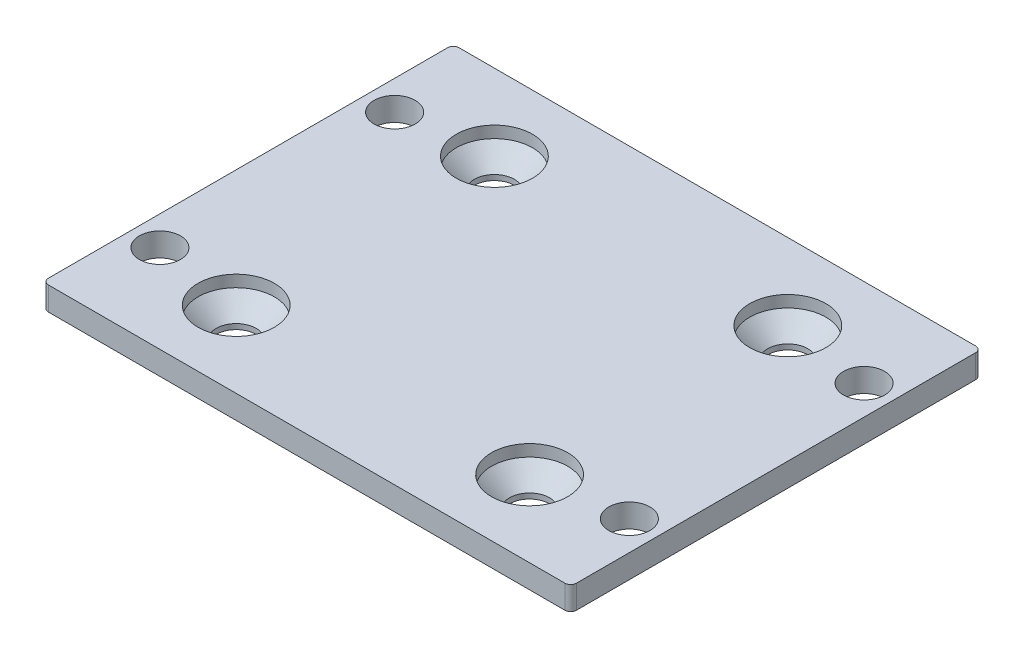
ISO-10303-21;
HEADER;
FILE_DESCRIPTION(('STEP AP214'),'2;1');
FILE_NAME('part.step','',(''),(''),'','','');
FILE_SCHEMA(('AUTOMOTIVE_DESIGN { 1 0 10303 214 1 1 1 1 }'));
ENDSEC;
DATA;
#1=APPLICATION_CONTEXT('core data for automotive mechanical design processes');
#2=APPLICATION_PROTOCOL_DEFINITION('international standard','automotive_design',2000,#1);
#3=PRODUCT_CONTEXT('',#1,'mechanical');
#4=PRODUCT('Part','Part','',(#3));
#5=PRODUCT_RELATED_PRODUCT_CATEGORY('part','',(#4));
#6=PRODUCT_DEFINITION_FORMATION('','',#4);
#7=PRODUCT_DEFINITION_CONTEXT('part definition',#1,'design');
#8=PRODUCT_DEFINITION('design','',#6,#7);
#9=PRODUCT_DEFINITION_SHAPE('','',#8);
#10=(LENGTH_UNIT() NAMED_UNIT(*) SI_UNIT(.MILLI.,.METRE.));
#11=(NAMED_UNIT(*) PLANE_ANGLE_UNIT() SI_UNIT($,.RADIAN.));
#12=(NAMED_UNIT(*) SI_UNIT($,.STERADIAN.) SOLID_ANGLE_UNIT());
#13=UNCERTAINTY_MEASURE_WITH_UNIT(LENGTH_MEASURE(1.E-05),#10,'distance_accuracy_value','');
#14=(GEOMETRIC_REPRESENTATION_CONTEXT(3) GLOBAL_UNCERTAINTY_ASSIGNED_CONTEXT((#13)) GLOBAL_UNIT_ASSIGNED_CONTEXT((#10,
#11,#12)) REPRESENTATION_CONTEXT('',''));
#15=CARTESIAN_POINT('',(0.,0.,0.));
#16=DIRECTION('',(0.,0.,1.));
#17=DIRECTION('',(1.,0.,0.));
#18=AXIS2_PLACEMENT_3D('',#15,#16,#17);
#19=CARTESIAN_POINT('',(0.,0.,0.));
#20=DIRECTION('',(0.,1.,0.));
#21=DIRECTION('',(0.,0.,1.));
#22=AXIS2_PLACEMENT_3D('',#19,#20,#21);
#23=PLANE('',#22);
#24=CARTESIAN_POINT('',(-20.,0.,-10.));
#25=DIRECTION('',(0.,-1.,0.));
#26=DIRECTION('',(0.,0.,-1.));
#27=AXIS2_PLACEMENT_3D('',#24,#25,#26);
#28=CIRCLE('',#27,1.75);
#29=CARTESIAN_POINT('',(-20.,0.,-11.75));
#30=VERTEX_POINT('',#29);
#31=EDGE_CURVE('E845',#30,#30,#28,.T.);
#32=ORIENTED_EDGE('',*,*,#31,.F.);
#33=EDGE_LOOP('',(#32));
#34=FACE_BOUND('',#33,.T.);
#35=CARTESIAN_POINT('',(20.,0.,-10.));
#36=DIRECTION('',(0.,-1.,0.));
#37=DIRECTION('',(0.,0.,-1.));
#38=AXIS2_PLACEMENT_3D('',#35,#36,#37);
#39=CIRCLE('',#38,1.75);
#40=CARTESIAN_POINT('',(20.,0.,-11.75));
#41=VERTEX_POINT('',#40);
#42=EDGE_CURVE('E841',#41,#41,#39,.T.);
#43=ORIENTED_EDGE('',*,*,#42,.F.);
#44=EDGE_LOOP('',(#43));
#45=FACE_BOUND('',#44,.T.);
#46=CARTESIAN_POINT('',(20.,0.,10.));
#47=DIRECTION('',(0.,-1.,0.));
#48=DIRECTION('',(0.,0.,-1.));
#49=AXIS2_PLACEMENT_3D('',#46,#47,#48);
#50=CIRCLE('',#49,1.75);
#51=CARTESIAN_POINT('',(20.,0.,8.25));
#52=VERTEX_POINT('',#51);
#53=EDGE_CURVE('E837',#52,#52,#50,.T.);
#54=ORIENTED_EDGE('',*,*,#53,.F.);
#55=EDGE_LOOP('',(#54));
#56=FACE_BOUND('',#55,.T.);
#57=CARTESIAN_POINT('',(-20.,0.,10.));
#58=DIRECTION('',(0.,-1.,0.));
#59=DIRECTION('',(0.,0.,-1.));
#60=AXIS2_PLACEMENT_3D('',#57,#58,#59);
#61=CIRCLE('',#60,1.75);
#62=CARTESIAN_POINT('',(-20.,0.,8.25));
#63=VERTEX_POINT('',#62);
#64=EDGE_CURVE('E833',#63,#63,#61,.T.);
#65=ORIENTED_EDGE('',*,*,#64,.F.);
#66=EDGE_LOOP('',(#65));
#67=FACE_BOUND('',#66,.T.);
#68=DIRECTION('',(-1.,0.,0.));
#69=VECTOR('',#68,1.);
#70=CARTESIAN_POINT('',(-22.5,0.,-17.5));
#71=LINE('',#70,#69);
#72=CARTESIAN_POINT('',(22.,0.,-17.5));
#73=VERTEX_POINT('',#72);
#74=CARTESIAN_POINT('',(-22.,0.,-17.5));
#75=VERTEX_POINT('',#74);
#76=EDGE_CURVE('E225',#73,#75,#71,.T.);
#77=ORIENTED_EDGE('',*,*,#76,.F.);
#78=CARTESIAN_POINT('',(22.,0.,-17.));
#79=DIRECTION('',(0.,1.,0.));
#80=DIRECTION('',(0.,0.,1.));
#81=AXIS2_PLACEMENT_3D('',#78,#79,#80);
#82=CIRCLE('',#81,0.5);
#83=CARTESIAN_POINT('',(22.5,0.,-17.));
#84=VERTEX_POINT('',#83);
#85=EDGE_CURVE('E259',#73,#84,#82,.F.);
#86=ORIENTED_EDGE('',*,*,#85,.T.);
#87=DIRECTION('',(0.,0.,-1.));
#88=VECTOR('',#87,1.);
#89=CARTESIAN_POINT('',(22.5,0.,-17.5));
#90=LINE('',#89,#88);
#91=CARTESIAN_POINT('',(22.5,0.,17.));
#92=VERTEX_POINT('',#91);
#93=EDGE_CURVE('E209',#92,#84,#90,.T.);
#94=ORIENTED_EDGE('',*,*,#93,.F.);
#95=CARTESIAN_POINT('',(22.,0.,17.));
#96=DIRECTION('',(0.,1.,0.));
#97=DIRECTION('',(0.,0.,1.));
#98=AXIS2_PLACEMENT_3D('',#95,#96,#97);
#99=CIRCLE('',#98,0.5);
#100=CARTESIAN_POINT('',(22.,0.,17.5));
#101=VERTEX_POINT('',#100);
#102=EDGE_CURVE('E255',#92,#101,#99,.F.);
#103=ORIENTED_EDGE('',*,*,#102,.T.);
#104=DIRECTION('',(1.,0.,0.));
#105=VECTOR('',#104,1.);
#106=CARTESIAN_POINT('',(-22.5,0.,17.5));
#107=LINE('',#106,#105);
#108=CARTESIAN_POINT('',(-22.,0.,17.5));
#109=VERTEX_POINT('',#108);
#110=EDGE_CURVE('E214',#109,#101,#107,.T.);
#111=ORIENTED_EDGE('',*,*,#110,.F.);
#112=CARTESIAN_POINT('',(-22.,0.,17.));
#113=DIRECTION('',(0.,1.,0.));
#114=DIRECTION('',(0.,0.,1.));
#115=AXIS2_PLACEMENT_3D('',#112,#113,#114);
#116=CIRCLE('',#115,0.5);
#117=CARTESIAN_POINT('',(-22.5,0.,17.));
#118=VERTEX_POINT('',#117);
#119=EDGE_CURVE('E253',#109,#118,#116,.F.);
#120=ORIENTED_EDGE('',*,*,#119,.T.);
#121=DIRECTION('',(0.,0.,1.));
#122=VECTOR('',#121,1.);
#123=CARTESIAN_POINT('',(-22.5,0.,-17.5));
#124=LINE('',#123,#122);
#125=CARTESIAN_POINT('',(-22.5,0.,-17.));
#126=VERTEX_POINT('',#125);
#127=EDGE_CURVE('E228',#126,#118,#124,.T.);
#128=ORIENTED_EDGE('',*,*,#127,.F.);
#129=CARTESIAN_POINT('',(-22.,0.,-17.));
#130=DIRECTION('',(0.,1.,0.));
#131=DIRECTION('',(0.,0.,1.));
#132=AXIS2_PLACEMENT_3D('',#129,#130,#131);
#133=CIRCLE('',#132,0.5);
#134=EDGE_CURVE('E257',#126,#75,#133,.F.);
#135=ORIENTED_EDGE('',*,*,#134,.T.);
#136=EDGE_LOOP('',(#77,#86,#94,#103,#111,#120,#128,#135));
#137=FACE_BOUND('',#136,.T.);
#138=DIRECTION('',(0.,0.,1.));
#139=VECTOR('',#138,1.);
#140=CARTESIAN_POINT('',(17.5,0.,16.));
#141=LINE('',#140,#139);
#142=CARTESIAN_POINT('',(17.5,0.,-11.));
#143=VERTEX_POINT('',#142);
#144=CARTESIAN_POINT('',(17.5,0.,11.));
#145=VERTEX_POINT('',#144);
#146=EDGE_CURVE('E199',#143,#145,#141,.T.);
#147=ORIENTED_EDGE('',*,*,#146,.F.);
#148=CARTESIAN_POINT('',(12.5,0.,-11.));
#149=DIRECTION('',(0.,1.,0.));
#150=DIRECTION('',(0.,0.,1.));
#151=AXIS2_PLACEMENT_3D('',#148,#149,#150);
#152=CIRCLE('',#151,5.);
#153=CARTESIAN_POINT('',(12.5,0.,-16.));
#154=VERTEX_POINT('',#153);
#155=EDGE_CURVE('E245',#143,#154,#152,.T.);
#156=ORIENTED_EDGE('',*,*,#155,.T.);
#157=DIRECTION('',(1.,0.,0.));
#158=VECTOR('',#157,1.);
#159=CARTESIAN_POINT('',(-17.5,0.,-16.));
#160=LINE('',#159,#158);
#161=CARTESIAN_POINT('',(-12.5,0.,-16.));
#162=VERTEX_POINT('',#161);
#163=EDGE_CURVE('E202',#162,#154,#160,.T.);
#164=ORIENTED_EDGE('',*,*,#163,.F.);
#165=CARTESIAN_POINT('',(-12.5,0.,-11.));
#166=DIRECTION('',(0.,1.,0.));
#167=DIRECTION('',(0.,0.,1.));
#168=AXIS2_PLACEMENT_3D('',#165,#166,#167);
#169=CIRCLE('',#168,5.);
#170=CARTESIAN_POINT('',(-17.5,0.,-11.));
#171=VERTEX_POINT('',#170);
#172=EDGE_CURVE('E192',#162,#171,#169,.T.);
#173=ORIENTED_EDGE('',*,*,#172,.T.);
#174=DIRECTION('',(0.,0.,-1.));
#175=VECTOR('',#174,1.);
#176=CARTESIAN_POINT('',(-17.5,0.,16.));
#177=LINE('',#176,#175);
#178=CARTESIAN_POINT('',(-17.5,0.,11.));
#179=VERTEX_POINT('',#178);
#180=EDGE_CURVE('E198',#179,#171,#177,.T.);
#181=ORIENTED_EDGE('',*,*,#180,.F.);
#182=CARTESIAN_POINT('',(-12.5,0.,11.));
#183=DIRECTION('',(0.,1.,0.));
#184=DIRECTION('',(0.,0.,1.));
#185=AXIS2_PLACEMENT_3D('',#182,#183,#184);
#186=CIRCLE('',#185,5.);
#187=CARTESIAN_POINT('',(-12.5,0.,16.));
#188=VERTEX_POINT('',#187);
#189=EDGE_CURVE('E197',#179,#188,#186,.T.);
#190=ORIENTED_EDGE('',*,*,#189,.T.);
#191=DIRECTION('',(-1.,0.,0.));
#192=VECTOR('',#191,1.);
#193=CARTESIAN_POINT('',(-17.5,0.,16.));
#194=LINE('',#193,#192);
#195=CARTESIAN_POINT('',(12.5,0.,16.));
#196=VERTEX_POINT('',#195);
#197=EDGE_CURVE('E175',#196,#188,#194,.T.);
#198=ORIENTED_EDGE('',*,*,#197,.F.);
#199=CARTESIAN_POINT('',(12.5,0.,11.));
#200=DIRECTION('',(0.,1.,0.));
#201=DIRECTION('',(0.,0.,1.));
#202=AXIS2_PLACEMENT_3D('',#199,#200,#201);
#203=CIRCLE('',#202,5.);
#204=EDGE_CURVE('E185',#196,#145,#203,.T.);
#205=ORIENTED_EDGE('',*,*,#204,.T.);
#206=EDGE_LOOP('',(#147,#156,#164,#173,#181,#190,#198,#205));
#207=FACE_BOUND('',#206,.T.);
#208=ADVANCED_FACE('F32',(#34,#45,#56,#67,#137,#207),#23,.F.);
#209=CARTESIAN_POINT('',(22.5,2.,-17.5));
#210=DIRECTION('',(-1.,0.,0.));
#211=DIRECTION('',(0.,0.,1.));
#212=AXIS2_PLACEMENT_3D('',#209,#210,#211);
#213=PLANE('',#212);
#214=ORIENTED_EDGE('',*,*,#93,.T.);
#215=DIRECTION('',(0.,-1.,0.));
#216=VECTOR('',#215,1.);
#217=CARTESIAN_POINT('',(22.5,2.,-17.));
#218=LINE('',#217,#216);
#219=CARTESIAN_POINT('',(22.5,2.,-17.));
#220=VERTEX_POINT('',#219);
#221=EDGE_CURVE('E264',#84,#220,#218,.F.);
#222=ORIENTED_EDGE('',*,*,#221,.T.);
#223=DIRECTION('',(0.,0.,-1.));
#224=VECTOR('',#223,1.);
#225=CARTESIAN_POINT('',(22.5,2.,-17.5));
#226=LINE('',#225,#224);
#227=CARTESIAN_POINT('',(22.5,2.,17.));
#228=VERTEX_POINT('',#227);
#229=EDGE_CURVE('E210',#228,#220,#226,.T.);
#230=ORIENTED_EDGE('',*,*,#229,.F.);
#231=DIRECTION('',(0.,-1.,0.));
#232=VECTOR('',#231,1.);
#233=CARTESIAN_POINT('',(22.5,2.,17.));
#234=LINE('',#233,#232);
#235=EDGE_CURVE('E261',#228,#92,#234,.T.);
#236=ORIENTED_EDGE('',*,*,#235,.T.);
#237=EDGE_LOOP('',(#214,#222,#230,#236));
#238=FACE_BOUND('',#237,.T.);
#239=ADVANCED_FACE('F394',(#238),#213,.F.);
#240=CARTESIAN_POINT('',(-22.5,2.,-17.5));
#241=DIRECTION('',(0.,0.,1.));
#242=DIRECTION('',(1.,0.,0.));
#243=AXIS2_PLACEMENT_3D('',#240,#241,#242);
#244=PLANE('',#243);
#245=DIRECTION('',(-1.,0.,0.));
#246=VECTOR('',#245,1.);
#247=CARTESIAN_POINT('',(-22.5,2.,-17.5));
#248=LINE('',#247,#246);
#249=CARTESIAN_POINT('',(22.,2.,-17.5));
#250=VERTEX_POINT('',#249);
#251=CARTESIAN_POINT('',(-22.,2.,-17.5));
#252=VERTEX_POINT('',#251);
#253=EDGE_CURVE('E213',#250,#252,#248,.T.);
#254=ORIENTED_EDGE('',*,*,#253,.F.);
#255=DIRECTION('',(0.,-1.,0.));
#256=VECTOR('',#255,1.);
#257=CARTESIAN_POINT('',(22.,2.,-17.5));
#258=LINE('',#257,#256);
#259=EDGE_CURVE('E250',#250,#73,#258,.T.);
#260=ORIENTED_EDGE('',*,*,#259,.T.);
#261=ORIENTED_EDGE('',*,*,#76,.T.);
#262=DIRECTION('',(0.,-1.,0.));
#263=VECTOR('',#262,1.);
#264=CARTESIAN_POINT('',(-22.,2.,-17.5));
#265=LINE('',#264,#263);
#266=EDGE_CURVE('E248',#75,#252,#265,.F.);
#267=ORIENTED_EDGE('',*,*,#266,.T.);
#268=EDGE_LOOP('',(#254,#260,#261,#267));
#269=FACE_BOUND('',#268,.T.);
#270=ADVANCED_FACE('F400',(#269),#244,.F.);
#271=CARTESIAN_POINT('',(-22.5,2.,-17.5));
#272=DIRECTION('',(1.,0.,0.));
#273=DIRECTION('',(0.,0.,-1.));
#274=AXIS2_PLACEMENT_3D('',#271,#272,#273);
#275=PLANE('',#274);
#276=DIRECTION('',(0.,0.,1.));
#277=VECTOR('',#276,1.);
#278=CARTESIAN_POINT('',(-22.5,2.,-17.5));
#279=LINE('',#278,#277);
#280=CARTESIAN_POINT('',(-22.5,2.,-17.));
#281=VERTEX_POINT('',#280);
#282=CARTESIAN_POINT('',(-22.5,2.,17.));
#283=VERTEX_POINT('',#282);
#284=EDGE_CURVE('E217',#281,#283,#279,.T.);
#285=ORIENTED_EDGE('',*,*,#284,.F.);
#286=DIRECTION('',(0.,-1.,0.));
#287=VECTOR('',#286,1.);
#288=CARTESIAN_POINT('',(-22.5,2.,-17.));
#289=LINE('',#288,#287);
#290=EDGE_CURVE('E276',#281,#126,#289,.T.);
#291=ORIENTED_EDGE('',*,*,#290,.T.);
#292=ORIENTED_EDGE('',*,*,#127,.T.);
#293=DIRECTION('',(0.,-1.,0.));
#294=VECTOR('',#293,1.);
#295=CARTESIAN_POINT('',(-22.5,2.,17.));
#296=LINE('',#295,#294);
#297=EDGE_CURVE('E274',#118,#283,#296,.F.);
#298=ORIENTED_EDGE('',*,*,#297,.T.);
#299=EDGE_LOOP('',(#285,#291,#292,#298));
#300=FACE_BOUND('',#299,.T.);
#301=ADVANCED_FACE('F412',(#300),#275,.F.);
#302=CARTESIAN_POINT('',(-22.5,2.,17.5));
#303=DIRECTION('',(0.,0.,-1.));
#304=DIRECTION('',(-1.,0.,0.));
#305=AXIS2_PLACEMENT_3D('',#302,#303,#304);
#306=PLANE('',#305);
#307=ORIENTED_EDGE('',*,*,#110,.T.);
#308=DIRECTION('',(0.,-1.,0.));
#309=VECTOR('',#308,1.);
#310=CARTESIAN_POINT('',(22.,2.,17.5));
#311=LINE('',#310,#309);
#312=CARTESIAN_POINT('',(22.,2.,17.5));
#313=VERTEX_POINT('',#312);
#314=EDGE_CURVE('E282',#101,#313,#311,.F.);
#315=ORIENTED_EDGE('',*,*,#314,.T.);
#316=DIRECTION('',(1.,0.,0.));
#317=VECTOR('',#316,1.);
#318=CARTESIAN_POINT('',(-22.5,2.,17.5));
#319=LINE('',#318,#317);
#320=CARTESIAN_POINT('',(-22.,2.,17.5));
#321=VERTEX_POINT('',#320);
#322=EDGE_CURVE('E220',#321,#313,#319,.T.);
#323=ORIENTED_EDGE('',*,*,#322,.F.);
#324=DIRECTION('',(0.,-1.,0.));
#325=VECTOR('',#324,1.);
#326=CARTESIAN_POINT('',(-22.,2.,17.5));
#327=LINE('',#326,#325);
#328=EDGE_CURVE('E279',#321,#109,#327,.T.);
#329=ORIENTED_EDGE('',*,*,#328,.T.);
#330=EDGE_LOOP('',(#307,#315,#323,#329));
#331=FACE_BOUND('',#330,.T.);
#332=ADVANCED_FACE('F409',(#331),#306,.F.);
#333=CARTESIAN_POINT('',(0.,2.,0.));
#334=DIRECTION('',(0.,1.,0.));
#335=DIRECTION('',(0.,0.,1.));
#336=AXIS2_PLACEMENT_3D('',#333,#334,#335);
#337=PLANE('',#336);
#338=CARTESIAN_POINT('',(-12.5,2.,11.));
#339=DIRECTION('',(0.,1.,0.));
#340=DIRECTION('',(0.,0.,1.));
#341=AXIS2_PLACEMENT_3D('',#338,#339,#340);
#342=CIRCLE('',#341,3.24999999999999);
#343=CARTESIAN_POINT('',(-12.5,2.,14.25));
#344=VERTEX_POINT('',#343);
#345=EDGE_CURVE('E784',#344,#344,#342,.T.);
#346=ORIENTED_EDGE('',*,*,#345,.F.);
#347=EDGE_LOOP('',(#346));
#348=FACE_BOUND('',#347,.T.);
#349=CARTESIAN_POINT('',(12.5,2.,-11.));
#350=DIRECTION('',(0.,1.,0.));
#351=DIRECTION('',(0.,0.,1.));
#352=AXIS2_PLACEMENT_3D('',#349,#350,#351);
#353=CIRCLE('',#352,3.24999999999999);
#354=CARTESIAN_POINT('',(12.5,2.,-7.75000000000001));
#355=VERTEX_POINT('',#354);
#356=EDGE_CURVE('E788',#355,#355,#353,.T.);
#357=ORIENTED_EDGE('',*,*,#356,.F.);
#358=EDGE_LOOP('',(#357));
#359=FACE_BOUND('',#358,.T.);
#360=CARTESIAN_POINT('',(-12.5,2.,-11.));
#361=DIRECTION('',(0.,1.,0.));
#362=DIRECTION('',(0.,0.,1.));
#363=AXIS2_PLACEMENT_3D('',#360,#361,#362);
#364=CIRCLE('',#363,3.24999999999999);
#365=CARTESIAN_POINT('',(-12.5,2.,-7.75000000000001));
#366=VERTEX_POINT('',#365);
#367=EDGE_CURVE('E792',#366,#366,#364,.T.);
#368=ORIENTED_EDGE('',*,*,#367,.F.);
#369=EDGE_LOOP('',(#368));
#370=FACE_BOUND('',#369,.T.);
#371=CARTESIAN_POINT('',(12.5,2.,11.));
#372=DIRECTION('',(0.,1.,0.));
#373=DIRECTION('',(0.,0.,1.));
#374=AXIS2_PLACEMENT_3D('',#371,#372,#373);
#375=CIRCLE('',#374,3.24999999999999);
#376=CARTESIAN_POINT('',(12.5,2.,14.25));
#377=VERTEX_POINT('',#376);
#378=EDGE_CURVE('E796',#377,#377,#375,.T.);
#379=ORIENTED_EDGE('',*,*,#378,.F.);
#380=EDGE_LOOP('',(#379));
#381=FACE_BOUND('',#380,.T.);
#382=CARTESIAN_POINT('',(-20.,2.,-10.));
#383=DIRECTION('',(0.,-1.,0.));
#384=DIRECTION('',(0.,0.,-1.));
#385=AXIS2_PLACEMENT_3D('',#382,#383,#384);
#386=CIRCLE('',#385,1.75);
#387=CARTESIAN_POINT('',(-20.,2.,-11.75));
#388=VERTEX_POINT('',#387);
#389=EDGE_CURVE('E800',#388,#388,#386,.T.);
#390=ORIENTED_EDGE('',*,*,#389,.T.);
#391=EDGE_LOOP('',(#390));
#392=FACE_BOUND('',#391,.T.);
#393=CARTESIAN_POINT('',(20.,2.,-10.));
#394=DIRECTION('',(0.,-1.,0.));
#395=DIRECTION('',(0.,0.,-1.));
#396=AXIS2_PLACEMENT_3D('',#393,#394,#395);
#397=CIRCLE('',#396,1.75);
#398=CARTESIAN_POINT('',(20.,2.,-11.75));
#399=VERTEX_POINT('',#398);
#400=EDGE_CURVE('E804',#399,#399,#397,.T.);
#401=ORIENTED_EDGE('',*,*,#400,.T.);
#402=EDGE_LOOP('',(#401));
#403=FACE_BOUND('',#402,.T.);
#404=CARTESIAN_POINT('',(20.,2.,10.));
#405=DIRECTION('',(0.,-1.,0.));
#406=DIRECTION('',(0.,0.,-1.));
#407=AXIS2_PLACEMENT_3D('',#404,#405,#406);
#408=CIRCLE('',#407,1.75);
#409=CARTESIAN_POINT('',(20.,2.,8.25));
#410=VERTEX_POINT('',#409);
#411=EDGE_CURVE('E808',#410,#410,#408,.T.);
#412=ORIENTED_EDGE('',*,*,#411,.T.);
#413=EDGE_LOOP('',(#412));
#414=FACE_BOUND('',#413,.T.);
#415=CARTESIAN_POINT('',(-20.,2.,10.));
#416=DIRECTION('',(0.,-1.,0.));
#417=DIRECTION('',(0.,0.,-1.));
#418=AXIS2_PLACEMENT_3D('',#415,#416,#417);
#419=CIRCLE('',#418,1.75);
#420=CARTESIAN_POINT('',(-20.,2.,8.25));
#421=VERTEX_POINT('',#420);
#422=EDGE_CURVE('E317',#421,#421,#419,.T.);
#423=ORIENTED_EDGE('',*,*,#422,.T.);
#424=EDGE_LOOP('',(#423));
#425=FACE_BOUND('',#424,.T.);
#426=ORIENTED_EDGE('',*,*,#229,.T.);
#427=CARTESIAN_POINT('',(22.,2.,-17.));
#428=DIRECTION('',(0.,1.,0.));
#429=DIRECTION('',(0.,0.,1.));
#430=AXIS2_PLACEMENT_3D('',#427,#428,#429);
#431=CIRCLE('',#430,0.5);
#432=EDGE_CURVE('E272',#220,#250,#431,.T.);
#433=ORIENTED_EDGE('',*,*,#432,.T.);
#434=ORIENTED_EDGE('',*,*,#253,.T.);
#435=CARTESIAN_POINT('',(-22.,2.,-17.));
#436=DIRECTION('',(0.,1.,0.));
#437=DIRECTION('',(0.,0.,1.));
#438=AXIS2_PLACEMENT_3D('',#435,#436,#437);
#439=CIRCLE('',#438,0.5);
#440=EDGE_CURVE('E270',#252,#281,#439,.T.);
#441=ORIENTED_EDGE('',*,*,#440,.T.);
#442=ORIENTED_EDGE('',*,*,#284,.T.);
#443=CARTESIAN_POINT('',(-22.,2.,17.));
#444=DIRECTION('',(0.,1.,0.));
#445=DIRECTION('',(0.,0.,1.));
#446=AXIS2_PLACEMENT_3D('',#443,#444,#445);
#447=CIRCLE('',#446,0.5);
#448=EDGE_CURVE('E266',#283,#321,#447,.T.);
#449=ORIENTED_EDGE('',*,*,#448,.T.);
#450=ORIENTED_EDGE('',*,*,#322,.T.);
#451=CARTESIAN_POINT('',(22.,2.,17.));
#452=DIRECTION('',(0.,1.,0.));
#453=DIRECTION('',(0.,0.,1.));
#454=AXIS2_PLACEMENT_3D('',#451,#452,#453);
#455=CIRCLE('',#454,0.5);
#456=EDGE_CURVE('E268',#313,#228,#455,.T.);
#457=ORIENTED_EDGE('',*,*,#456,.T.);
#458=EDGE_LOOP('',(#426,#433,#434,#441,#442,#449,#450,#457));
#459=FACE_BOUND('',#458,.T.);
#460=ADVANCED_FACE('F407',(#348,#359,#370,#381,#392,#403,#414,#425,#459),#337,.T.);
#461=CARTESIAN_POINT('',(17.5,-1.,16.));
#462=DIRECTION('',(-1.,0.,0.));
#463=DIRECTION('',(0.,0.,1.));
#464=AXIS2_PLACEMENT_3D('',#461,#462,#463);
#465=PLANE('',#464);
#466=DIRECTION('',(0.,1.,0.));
#467=VECTOR('',#466,1.);
#468=CARTESIAN_POINT('',(17.5,-1.,11.));
#469=LINE('',#468,#467);
#470=CARTESIAN_POINT('',(17.5,-0.5,11.));
#471=VERTEX_POINT('',#470);
#472=EDGE_CURVE('E188',#145,#471,#469,.F.);
#473=ORIENTED_EDGE('',*,*,#472,.T.);
#474=DIRECTION('',(0.,0.,-1.));
#475=VECTOR('',#474,1.);
#476=CARTESIAN_POINT('',(17.5,-0.5,-11.));
#477=LINE('',#476,#475);
#478=CARTESIAN_POINT('',(17.5,-0.5,-11.));
#479=VERTEX_POINT('',#478);
#480=EDGE_CURVE('E301',#471,#479,#477,.T.);
#481=ORIENTED_EDGE('',*,*,#480,.T.);
#482=DIRECTION('',(0.,1.,0.));
#483=VECTOR('',#482,1.);
#484=CARTESIAN_POINT('',(17.5,-1.,-11.));
#485=LINE('',#484,#483);
#486=EDGE_CURVE('E181',#479,#143,#485,.T.);
#487=ORIENTED_EDGE('',*,*,#486,.T.);
#488=ORIENTED_EDGE('',*,*,#146,.T.);
#489=EDGE_LOOP('',(#473,#481,#487,#488));
#490=FACE_BOUND('',#489,.T.);
#491=ADVANCED_FACE('F369',(#490),#465,.F.);
#492=CARTESIAN_POINT('',(-17.5,-1.,16.));
#493=DIRECTION('',(0.,0.,-1.));
#494=DIRECTION('',(-1.,0.,0.));
#495=AXIS2_PLACEMENT_3D('',#492,#493,#494);
#496=PLANE('',#495);
#497=DIRECTION('',(0.,1.,0.));
#498=VECTOR('',#497,1.);
#499=CARTESIAN_POINT('',(-12.5,-1.,16.));
#500=LINE('',#499,#498);
#501=CARTESIAN_POINT('',(-12.5,-0.5,16.));
#502=VERTEX_POINT('',#501);
#503=EDGE_CURVE('E182',#188,#502,#500,.F.);
#504=ORIENTED_EDGE('',*,*,#503,.T.);
#505=DIRECTION('',(1.,0.,0.));
#506=VECTOR('',#505,1.);
#507=CARTESIAN_POINT('',(12.5,-0.5,16.));
#508=LINE('',#507,#506);
#509=CARTESIAN_POINT('',(12.5,-0.5,16.));
#510=VERTEX_POINT('',#509);
#511=EDGE_CURVE('E178',#502,#510,#508,.T.);
#512=ORIENTED_EDGE('',*,*,#511,.T.);
#513=DIRECTION('',(0.,1.,0.));
#514=VECTOR('',#513,1.);
#515=CARTESIAN_POINT('',(12.5,-1.,16.));
#516=LINE('',#515,#514);
#517=EDGE_CURVE('E170',#510,#196,#516,.T.);
#518=ORIENTED_EDGE('',*,*,#517,.T.);
#519=ORIENTED_EDGE('',*,*,#197,.T.);
#520=EDGE_LOOP('',(#504,#512,#518,#519));
#521=FACE_BOUND('',#520,.T.);
#522=ADVANCED_FACE('F173',(#521),#496,.F.);
#523=CARTESIAN_POINT('',(-17.5,-1.,16.));
#524=DIRECTION('',(1.,0.,0.));
#525=DIRECTION('',(0.,0.,-1.));
#526=AXIS2_PLACEMENT_3D('',#523,#524,#525);
#527=PLANE('',#526);
#528=DIRECTION('',(0.,1.,0.));
#529=VECTOR('',#528,1.);
#530=CARTESIAN_POINT('',(-17.5,-1.,-11.));
#531=LINE('',#530,#529);
#532=CARTESIAN_POINT('',(-17.5,-0.5,-11.));
#533=VERTEX_POINT('',#532);
#534=EDGE_CURVE('E193',#171,#533,#531,.F.);
#535=ORIENTED_EDGE('',*,*,#534,.T.);
#536=DIRECTION('',(0.,0.,1.));
#537=VECTOR('',#536,1.);
#538=CARTESIAN_POINT('',(-17.5,-0.5,11.));
#539=LINE('',#538,#537);
#540=CARTESIAN_POINT('',(-17.5,-0.5,11.));
#541=VERTEX_POINT('',#540);
#542=EDGE_CURVE('E11',#533,#541,#539,.T.);
#543=ORIENTED_EDGE('',*,*,#542,.T.);
#544=DIRECTION('',(0.,1.,0.));
#545=VECTOR('',#544,1.);
#546=CARTESIAN_POINT('',(-17.5,-1.,11.));
#547=LINE('',#546,#545);
#548=EDGE_CURVE('E241',#541,#179,#547,.T.);
#549=ORIENTED_EDGE('',*,*,#548,.T.);
#550=ORIENTED_EDGE('',*,*,#180,.T.);
#551=EDGE_LOOP('',(#535,#543,#549,#550));
#552=FACE_BOUND('',#551,.T.);
#553=ADVANCED_FACE('F348',(#552),#527,.F.);
#554=CARTESIAN_POINT('',(-17.5,-1.,-16.));
#555=DIRECTION('',(0.,0.,1.));
#556=DIRECTION('',(1.,0.,0.));
#557=AXIS2_PLACEMENT_3D('',#554,#555,#556);
#558=PLANE('',#557);
#559=DIRECTION('',(0.,1.,0.));
#560=VECTOR('',#559,1.);
#561=CARTESIAN_POINT('',(12.5,-1.,-16.));
#562=LINE('',#561,#560);
#563=CARTESIAN_POINT('',(12.5,-0.5,-16.));
#564=VERTEX_POINT('',#563);
#565=EDGE_CURVE('E236',#154,#564,#562,.F.);
#566=ORIENTED_EDGE('',*,*,#565,.T.);
#567=DIRECTION('',(-1.,0.,0.));
#568=VECTOR('',#567,1.);
#569=CARTESIAN_POINT('',(-12.5,-0.5,-16.));
#570=LINE('',#569,#568);
#571=CARTESIAN_POINT('',(-12.5,-0.5,-16.));
#572=VERTEX_POINT('',#571);
#573=EDGE_CURVE('E309',#564,#572,#570,.T.);
#574=ORIENTED_EDGE('',*,*,#573,.T.);
#575=DIRECTION('',(0.,1.,0.));
#576=VECTOR('',#575,1.);
#577=CARTESIAN_POINT('',(-12.5,-1.,-16.));
#578=LINE('',#577,#576);
#579=EDGE_CURVE('E239',#572,#162,#578,.T.);
#580=ORIENTED_EDGE('',*,*,#579,.T.);
#581=ORIENTED_EDGE('',*,*,#163,.T.);
#582=EDGE_LOOP('',(#566,#574,#580,#581));
#583=FACE_BOUND('',#582,.T.);
#584=ADVANCED_FACE('F355',(#583),#558,.F.);
#585=CARTESIAN_POINT('',(0.,-1.,0.));
#586=DIRECTION('',(0.,-1.,0.));
#587=DIRECTION('',(0.,0.,-1.));
#588=AXIS2_PLACEMENT_3D('',#585,#586,#587);
#589=PLANE('',#588);
#590=CARTESIAN_POINT('',(-12.5,-0.999999999999999,-11.));
#591=DIRECTION('',(0.,1.,0.));
#592=DIRECTION('',(0.,0.,1.));
#593=AXIS2_PLACEMENT_3D('',#590,#591,#592);
#594=CIRCLE('',#593,1.7);
#595=CARTESIAN_POINT('',(-12.5,-0.999999999999999,-9.3));
#596=VERTEX_POINT('',#595);
#597=EDGE_CURVE('E880',#596,#596,#594,.T.);
#598=ORIENTED_EDGE('',*,*,#597,.T.);
#599=EDGE_LOOP('',(#598));
#600=FACE_BOUND('',#599,.T.);
#601=CARTESIAN_POINT('',(12.5,-0.999999999999999,11.));
#602=DIRECTION('',(0.,1.,0.));
#603=DIRECTION('',(0.,0.,1.));
#604=AXIS2_PLACEMENT_3D('',#601,#602,#603);
#605=CIRCLE('',#604,1.7);
#606=CARTESIAN_POINT('',(12.5,-0.999999999999999,12.7));
#607=VERTEX_POINT('',#606);
#608=EDGE_CURVE('E871',#607,#607,#605,.T.);
#609=ORIENTED_EDGE('',*,*,#608,.T.);
#610=EDGE_LOOP('',(#609));
#611=FACE_BOUND('',#610,.T.);
#612=CARTESIAN_POINT('',(-12.5,-0.999999999999999,11.));
#613=DIRECTION('',(0.,1.,0.));
#614=DIRECTION('',(0.,0.,1.));
#615=AXIS2_PLACEMENT_3D('',#612,#613,#614);
#616=CIRCLE('',#615,1.7);
#617=CARTESIAN_POINT('',(-12.5,-0.999999999999999,12.7));
#618=VERTEX_POINT('',#617);
#619=EDGE_CURVE('E862',#618,#618,#616,.T.);
#620=ORIENTED_EDGE('',*,*,#619,.T.);
#621=EDGE_LOOP('',(#620));
#622=FACE_BOUND('',#621,.T.);
#623=CARTESIAN_POINT('',(12.5,-0.999999999999999,-11.));
#624=DIRECTION('',(0.,1.,0.));
#625=DIRECTION('',(0.,0.,1.));
#626=AXIS2_PLACEMENT_3D('',#623,#624,#625);
#627=CIRCLE('',#626,1.7);
#628=CARTESIAN_POINT('',(12.5,-0.999999999999999,-9.3));
#629=VERTEX_POINT('',#628);
#630=EDGE_CURVE('E853',#629,#629,#627,.T.);
#631=ORIENTED_EDGE('',*,*,#630,.T.);
#632=EDGE_LOOP('',(#631));
#633=FACE_BOUND('',#632,.T.);
#634=CARTESIAN_POINT('',(12.5,-1.,-11.));
#635=DIRECTION('',(0.,-1.,0.));
#636=DIRECTION('',(0.,0.,-1.));
#637=AXIS2_PLACEMENT_3D('',#634,#635,#636);
#638=CIRCLE('',#637,4.50000000000001);
#639=CARTESIAN_POINT('',(12.5,-1.,-15.5));
#640=VERTEX_POINT('',#639);
#641=CARTESIAN_POINT('',(17.,-1.,-11.));
#642=VERTEX_POINT('',#641);
#643=EDGE_CURVE('E294',#640,#642,#638,.T.);
#644=ORIENTED_EDGE('',*,*,#643,.T.);
#645=DIRECTION('',(0.,0.,1.));
#646=VECTOR('',#645,1.);
#647=CARTESIAN_POINT('',(17.,-1.,11.));
#648=LINE('',#647,#646);
#649=CARTESIAN_POINT('',(17.,-1.,11.));
#650=VERTEX_POINT('',#649);
#651=EDGE_CURVE('E298',#642,#650,#648,.T.);
#652=ORIENTED_EDGE('',*,*,#651,.T.);
#653=CARTESIAN_POINT('',(12.5,-1.,11.));
#654=DIRECTION('',(0.,-1.,0.));
#655=DIRECTION('',(0.,0.,-1.));
#656=AXIS2_PLACEMENT_3D('',#653,#654,#655);
#657=CIRCLE('',#656,4.50000000000001);
#658=CARTESIAN_POINT('',(12.5,-1.,15.5));
#659=VERTEX_POINT('',#658);
#660=EDGE_CURVE('E296',#650,#659,#657,.T.);
#661=ORIENTED_EDGE('',*,*,#660,.T.);
#662=DIRECTION('',(-1.,0.,0.));
#663=VECTOR('',#662,1.);
#664=CARTESIAN_POINT('',(-12.5,-1.,15.5));
#665=LINE('',#664,#663);
#666=CARTESIAN_POINT('',(-12.5,-1.,15.5));
#667=VERTEX_POINT('',#666);
#668=EDGE_CURVE('E292',#659,#667,#665,.T.);
#669=ORIENTED_EDGE('',*,*,#668,.T.);
#670=CARTESIAN_POINT('',(-12.5,-1.,11.));
#671=DIRECTION('',(0.,-1.,0.));
#672=DIRECTION('',(0.,0.,-1.));
#673=AXIS2_PLACEMENT_3D('',#670,#671,#672);
#674=CIRCLE('',#673,4.50000000000001);
#675=CARTESIAN_POINT('',(-17.,-1.,11.));
#676=VERTEX_POINT('',#675);
#677=EDGE_CURVE('E288',#667,#676,#674,.T.);
#678=ORIENTED_EDGE('',*,*,#677,.T.);
#679=DIRECTION('',(0.,0.,-1.));
#680=VECTOR('',#679,1.);
#681=CARTESIAN_POINT('',(-17.,-1.,-11.));
#682=LINE('',#681,#680);
#683=CARTESIAN_POINT('',(-17.,-1.,-11.));
#684=VERTEX_POINT('',#683);
#685=EDGE_CURVE('E284',#676,#684,#682,.T.);
#686=ORIENTED_EDGE('',*,*,#685,.T.);
#687=CARTESIAN_POINT('',(-12.5,-1.,-11.));
#688=DIRECTION('',(0.,-1.,0.));
#689=DIRECTION('',(0.,0.,-1.));
#690=AXIS2_PLACEMENT_3D('',#687,#688,#689);
#691=CIRCLE('',#690,4.50000000000001);
#692=CARTESIAN_POINT('',(-12.5,-1.,-15.5));
#693=VERTEX_POINT('',#692);
#694=EDGE_CURVE('E286',#684,#693,#691,.T.);
#695=ORIENTED_EDGE('',*,*,#694,.T.);
#696=DIRECTION('',(1.,0.,0.));
#697=VECTOR('',#696,1.);
#698=CARTESIAN_POINT('',(12.5,-1.,-15.5));
#699=LINE('',#698,#697);
#700=EDGE_CURVE('E290',#693,#640,#699,.T.);
#701=ORIENTED_EDGE('',*,*,#700,.T.);
#702=EDGE_LOOP('',(#644,#652,#661,#669,#678,#686,#695,#701));
#703=FACE_BOUND('',#702,.T.);
#704=ADVANCED_FACE('F379',(#600,#611,#622,#633,#703),#589,.T.);
#705=CARTESIAN_POINT('',(12.5,-1.,11.));
#706=DIRECTION('',(0.,1.,0.));
#707=DIRECTION('',(0.,0.,1.));
#708=AXIS2_PLACEMENT_3D('',#705,#706,#707);
#709=CYLINDRICAL_SURFACE('',#708,5.);
#710=ORIENTED_EDGE('',*,*,#517,.F.);
#711=CARTESIAN_POINT('',(12.5,-0.5,11.));
#712=DIRECTION('',(0.,-1.,0.));
#713=DIRECTION('',(0.,0.,-1.));
#714=AXIS2_PLACEMENT_3D('',#711,#712,#713);
#715=CIRCLE('',#714,5.);
#716=EDGE_CURVE('E304',#510,#471,#715,.F.);
#717=ORIENTED_EDGE('',*,*,#716,.T.);
#718=ORIENTED_EDGE('',*,*,#472,.F.);
#719=ORIENTED_EDGE('',*,*,#204,.F.);
#720=EDGE_LOOP('',(#710,#717,#718,#719));
#721=FACE_BOUND('',#720,.T.);
#722=ADVANCED_FACE('F186',(#721),#709,.T.);
#723=CARTESIAN_POINT('',(-12.5,-1.,-11.));
#724=DIRECTION('',(0.,1.,0.));
#725=DIRECTION('',(0.,0.,1.));
#726=AXIS2_PLACEMENT_3D('',#723,#724,#725);
#727=CYLINDRICAL_SURFACE('',#726,5.);
#728=ORIENTED_EDGE('',*,*,#579,.F.);
#729=CARTESIAN_POINT('',(-12.5,-0.5,-11.));
#730=DIRECTION('',(0.,-1.,0.));
#731=DIRECTION('',(0.,0.,-1.));
#732=AXIS2_PLACEMENT_3D('',#729,#730,#731);
#733=CIRCLE('',#732,5.);
#734=EDGE_CURVE('E41',#572,#533,#733,.F.);
#735=ORIENTED_EDGE('',*,*,#734,.T.);
#736=ORIENTED_EDGE('',*,*,#534,.F.);
#737=ORIENTED_EDGE('',*,*,#172,.F.);
#738=EDGE_LOOP('',(#728,#735,#736,#737));
#739=FACE_BOUND('',#738,.T.);
#740=ADVANCED_FACE('F350',(#739),#727,.T.);
#741=CARTESIAN_POINT('',(12.5,-1.,-11.));
#742=DIRECTION('',(0.,1.,0.));
#743=DIRECTION('',(0.,0.,1.));
#744=AXIS2_PLACEMENT_3D('',#741,#742,#743);
#745=CYLINDRICAL_SURFACE('',#744,5.);
#746=ORIENTED_EDGE('',*,*,#486,.F.);
#747=CARTESIAN_POINT('',(12.5,-0.5,-11.));
#748=DIRECTION('',(0.,-1.,0.));
#749=DIRECTION('',(0.,0.,-1.));
#750=AXIS2_PLACEMENT_3D('',#747,#748,#749);
#751=CIRCLE('',#750,5.);
#752=EDGE_CURVE('E306',#479,#564,#751,.F.);
#753=ORIENTED_EDGE('',*,*,#752,.T.);
#754=ORIENTED_EDGE('',*,*,#565,.F.);
#755=ORIENTED_EDGE('',*,*,#155,.F.);
#756=EDGE_LOOP('',(#746,#753,#754,#755));
#757=FACE_BOUND('',#756,.T.);
#758=ADVANCED_FACE('F359',(#757),#745,.T.);
#759=CARTESIAN_POINT('',(-12.5,-1.,11.));
#760=DIRECTION('',(0.,1.,0.));
#761=DIRECTION('',(0.,0.,1.));
#762=AXIS2_PLACEMENT_3D('',#759,#760,#761);
#763=CYLINDRICAL_SURFACE('',#762,5.);
#764=ORIENTED_EDGE('',*,*,#548,.F.);
#765=CARTESIAN_POINT('',(-12.5,-0.5,11.));
#766=DIRECTION('',(0.,-1.,0.));
#767=DIRECTION('',(0.,0.,-1.));
#768=AXIS2_PLACEMENT_3D('',#765,#766,#767);
#769=CIRCLE('',#768,5.);
#770=EDGE_CURVE('E311',#541,#502,#769,.F.);
#771=ORIENTED_EDGE('',*,*,#770,.T.);
#772=ORIENTED_EDGE('',*,*,#503,.F.);
#773=ORIENTED_EDGE('',*,*,#189,.F.);
#774=EDGE_LOOP('',(#764,#771,#772,#773));
#775=FACE_BOUND('',#774,.T.);
#776=ADVANCED_FACE('F347',(#775),#763,.T.);
#777=CARTESIAN_POINT('',(22.,2.,-17.));
#778=DIRECTION('',(0.,-1.,0.));
#779=DIRECTION('',(0.,0.,-1.));
#780=AXIS2_PLACEMENT_3D('',#777,#778,#779);
#781=CYLINDRICAL_SURFACE('',#780,0.5);
#782=ORIENTED_EDGE('',*,*,#432,.F.);
#783=ORIENTED_EDGE('',*,*,#221,.F.);
#784=ORIENTED_EDGE('',*,*,#85,.F.);
#785=ORIENTED_EDGE('',*,*,#259,.F.);
#786=EDGE_LOOP('',(#782,#783,#784,#785));
#787=FACE_BOUND('',#786,.T.);
#788=ADVANCED_FACE('F428',(#787),#781,.T.);
#789=CARTESIAN_POINT('',(-22.,2.,-17.));
#790=DIRECTION('',(0.,-1.,0.));
#791=DIRECTION('',(0.,0.,-1.));
#792=AXIS2_PLACEMENT_3D('',#789,#790,#791);
#793=CYLINDRICAL_SURFACE('',#792,0.5);
#794=ORIENTED_EDGE('',*,*,#440,.F.);
#795=ORIENTED_EDGE('',*,*,#266,.F.);
#796=ORIENTED_EDGE('',*,*,#134,.F.);
#797=ORIENTED_EDGE('',*,*,#290,.F.);
#798=EDGE_LOOP('',(#794,#795,#796,#797));
#799=FACE_BOUND('',#798,.T.);
#800=ADVANCED_FACE('F431',(#799),#793,.T.);
#801=CARTESIAN_POINT('',(22.,2.,17.));
#802=DIRECTION('',(0.,-1.,0.));
#803=DIRECTION('',(0.,0.,-1.));
#804=AXIS2_PLACEMENT_3D('',#801,#802,#803);
#805=CYLINDRICAL_SURFACE('',#804,0.5);
#806=ORIENTED_EDGE('',*,*,#456,.F.);
#807=ORIENTED_EDGE('',*,*,#314,.F.);
#808=ORIENTED_EDGE('',*,*,#102,.F.);
#809=ORIENTED_EDGE('',*,*,#235,.F.);
#810=EDGE_LOOP('',(#806,#807,#808,#809));
#811=FACE_BOUND('',#810,.T.);
#812=ADVANCED_FACE('F435',(#811),#805,.T.);
#813=CARTESIAN_POINT('',(-22.,2.,17.));
#814=DIRECTION('',(0.,-1.,0.));
#815=DIRECTION('',(0.,0.,-1.));
#816=AXIS2_PLACEMENT_3D('',#813,#814,#815);
#817=CYLINDRICAL_SURFACE('',#816,0.5);
#818=ORIENTED_EDGE('',*,*,#448,.F.);
#819=ORIENTED_EDGE('',*,*,#297,.F.);
#820=ORIENTED_EDGE('',*,*,#119,.F.);
#821=ORIENTED_EDGE('',*,*,#328,.F.);
#822=EDGE_LOOP('',(#818,#819,#820,#821));
#823=FACE_BOUND('',#822,.T.);
#824=ADVANCED_FACE('F439',(#823),#817,.T.);
#825=CARTESIAN_POINT('',(-17.,-1.,0.));
#826=DIRECTION('',(-0.707106781186551,-0.707106781186544,0.));
#827=DIRECTION('',(0.,0.,1.));
#828=AXIS2_PLACEMENT_3D('',#825,#826,#827);
#829=PLANE('',#828);
#830=DIRECTION('',(0.707106781186543,-0.707106781186552,0.));
#831=VECTOR('',#830,1.);
#832=CARTESIAN_POINT('',(-17.5,-0.5,11.));
#833=LINE('',#832,#831);
#834=EDGE_CURVE('E330',#541,#676,#833,.T.);
#835=ORIENTED_EDGE('',*,*,#834,.F.);
#836=ORIENTED_EDGE('',*,*,#542,.F.);
#837=DIRECTION('',(-0.707106781186543,0.707106781186552,0.));
#838=VECTOR('',#837,1.);
#839=CARTESIAN_POINT('',(-17.,-1.,-11.));
#840=LINE('',#839,#838);
#841=EDGE_CURVE('E36',#684,#533,#840,.T.);
#842=ORIENTED_EDGE('',*,*,#841,.F.);
#843=ORIENTED_EDGE('',*,*,#685,.F.);
#844=EDGE_LOOP('',(#835,#836,#842,#843));
#845=FACE_BOUND('',#844,.T.);
#846=ADVANCED_FACE('F34',(#845),#829,.T.);
#847=CARTESIAN_POINT('',(-12.5,-1.,-11.));
#848=DIRECTION('',(0.,1.,0.));
#849=DIRECTION('',(0.,0.,1.));
#850=AXIS2_PLACEMENT_3D('',#847,#848,#849);
#851=CONICAL_SURFACE('',#850,4.50000000000001,0.785398163397441);
#852=ORIENTED_EDGE('',*,*,#841,.T.);
#853=ORIENTED_EDGE('',*,*,#734,.F.);
#854=DIRECTION('',(0.,0.707106781186552,-0.707106781186543));
#855=VECTOR('',#854,1.);
#856=CARTESIAN_POINT('',(-12.5,-1.,-15.5));
#857=LINE('',#856,#855);
#858=EDGE_CURVE('E328',#693,#572,#857,.T.);
#859=ORIENTED_EDGE('',*,*,#858,.F.);
#860=ORIENTED_EDGE('',*,*,#694,.F.);
#861=EDGE_LOOP('',(#852,#853,#859,#860));
#862=FACE_BOUND('',#861,.T.);
#863=ADVANCED_FACE('F340',(#862),#851,.T.);
#864=CARTESIAN_POINT('',(-12.5,-1.,11.));
#865=DIRECTION('',(0.,1.,0.));
#866=DIRECTION('',(0.,0.,1.));
#867=AXIS2_PLACEMENT_3D('',#864,#865,#866);
#868=CONICAL_SURFACE('',#867,4.50000000000001,0.785398163397441);
#869=ORIENTED_EDGE('',*,*,#834,.T.);
#870=ORIENTED_EDGE('',*,*,#677,.F.);
#871=DIRECTION('',(0.,-0.707106781186552,-0.707106781186543));
#872=VECTOR('',#871,1.);
#873=CARTESIAN_POINT('',(-12.5,-0.5,16.));
#874=LINE('',#873,#872);
#875=EDGE_CURVE('E325',#502,#667,#874,.T.);
#876=ORIENTED_EDGE('',*,*,#875,.F.);
#877=ORIENTED_EDGE('',*,*,#770,.F.);
#878=EDGE_LOOP('',(#869,#870,#876,#877));
#879=FACE_BOUND('',#878,.T.);
#880=ADVANCED_FACE('F345',(#879),#868,.T.);
#881=CARTESIAN_POINT('',(0.,-1.,-15.5));
#882=DIRECTION('',(0.,-0.707106781186543,-0.707106781186552));
#883=DIRECTION('',(-1.,0.,0.));
#884=AXIS2_PLACEMENT_3D('',#881,#882,#883);
#885=PLANE('',#884);
#886=ORIENTED_EDGE('',*,*,#858,.T.);
#887=ORIENTED_EDGE('',*,*,#573,.F.);
#888=DIRECTION('',(0.,0.707106781186552,-0.707106781186543));
#889=VECTOR('',#888,1.);
#890=CARTESIAN_POINT('',(12.5,-1.,-15.5));
#891=LINE('',#890,#889);
#892=EDGE_CURVE('E322',#640,#564,#891,.T.);
#893=ORIENTED_EDGE('',*,*,#892,.F.);
#894=ORIENTED_EDGE('',*,*,#700,.F.);
#895=EDGE_LOOP('',(#886,#887,#893,#894));
#896=FACE_BOUND('',#895,.T.);
#897=ADVANCED_FACE('F382',(#896),#885,.T.);
#898=CARTESIAN_POINT('',(0.,-1.,15.5));
#899=DIRECTION('',(0.,-0.707106781186543,0.707106781186552));
#900=DIRECTION('',(1.,0.,0.));
#901=AXIS2_PLACEMENT_3D('',#898,#899,#900);
#902=PLANE('',#901);
#903=ORIENTED_EDGE('',*,*,#875,.T.);
#904=ORIENTED_EDGE('',*,*,#668,.F.);
#905=DIRECTION('',(0.,-0.707106781186552,-0.707106781186543));
#906=VECTOR('',#905,1.);
#907=CARTESIAN_POINT('',(12.5,-0.5,16.));
#908=LINE('',#907,#906);
#909=EDGE_CURVE('E319',#510,#659,#908,.T.);
#910=ORIENTED_EDGE('',*,*,#909,.F.);
#911=ORIENTED_EDGE('',*,*,#511,.F.);
#912=EDGE_LOOP('',(#903,#904,#910,#911));
#913=FACE_BOUND('',#912,.T.);
#914=ADVANCED_FACE('F384',(#913),#902,.T.);
#915=CARTESIAN_POINT('',(12.5,-1.,-11.));
#916=DIRECTION('',(0.,1.,0.));
#917=DIRECTION('',(0.,0.,1.));
#918=AXIS2_PLACEMENT_3D('',#915,#916,#917);
#919=CONICAL_SURFACE('',#918,4.50000000000001,0.785398163397441);
#920=ORIENTED_EDGE('',*,*,#892,.T.);
#921=ORIENTED_EDGE('',*,*,#752,.F.);
#922=DIRECTION('',(0.707106781186543,0.707106781186552,0.));
#923=VECTOR('',#922,1.);
#924=CARTESIAN_POINT('',(17.,-1.,-11.));
#925=LINE('',#924,#923);
#926=EDGE_CURVE('E316',#642,#479,#925,.T.);
#927=ORIENTED_EDGE('',*,*,#926,.F.);
#928=ORIENTED_EDGE('',*,*,#643,.F.);
#929=EDGE_LOOP('',(#920,#921,#927,#928));
#930=FACE_BOUND('',#929,.T.);
#931=ADVANCED_FACE('F363',(#930),#919,.T.);
#932=CARTESIAN_POINT('',(12.5,-1.,11.));
#933=DIRECTION('',(0.,1.,0.));
#934=DIRECTION('',(0.,0.,1.));
#935=AXIS2_PLACEMENT_3D('',#932,#933,#934);
#936=CONICAL_SURFACE('',#935,4.50000000000001,0.785398163397441);
#937=ORIENTED_EDGE('',*,*,#909,.T.);
#938=ORIENTED_EDGE('',*,*,#660,.F.);
#939=DIRECTION('',(-0.707106781186543,-0.707106781186552,0.));
#940=VECTOR('',#939,1.);
#941=CARTESIAN_POINT('',(17.5,-0.5,11.));
#942=LINE('',#941,#940);
#943=EDGE_CURVE('E314',#471,#650,#942,.T.);
#944=ORIENTED_EDGE('',*,*,#943,.F.);
#945=ORIENTED_EDGE('',*,*,#716,.F.);
#946=EDGE_LOOP('',(#937,#938,#944,#945));
#947=FACE_BOUND('',#946,.T.);
#948=ADVANCED_FACE('F376',(#947),#936,.T.);
#949=CARTESIAN_POINT('',(17.,-1.,0.));
#950=DIRECTION('',(0.707106781186554,-0.707106781186541,0.));
#951=DIRECTION('',(0.,0.,-1.));
#952=AXIS2_PLACEMENT_3D('',#949,#950,#951);
#953=PLANE('',#952);
#954=ORIENTED_EDGE('',*,*,#926,.T.);
#955=ORIENTED_EDGE('',*,*,#480,.F.);
#956=ORIENTED_EDGE('',*,*,#943,.T.);
#957=ORIENTED_EDGE('',*,*,#651,.F.);
#958=EDGE_LOOP('',(#954,#955,#956,#957));
#959=FACE_BOUND('',#958,.T.);
#960=ADVANCED_FACE('F372',(#959),#953,.T.);
#961=CARTESIAN_POINT('',(-20.,2.,10.));
#962=DIRECTION('',(0.,-1.,0.));
#963=DIRECTION('',(0.,0.,-1.));
#964=AXIS2_PLACEMENT_3D('',#961,#962,#963);
#965=CYLINDRICAL_SURFACE('',#964,1.75);
#966=ORIENTED_EDGE('',*,*,#422,.F.);
#967=EDGE_LOOP('',(#966));
#968=FACE_BOUND('',#967,.T.);
#969=ORIENTED_EDGE('',*,*,#64,.T.);
#970=EDGE_LOOP('',(#969));
#971=FACE_BOUND('',#970,.T.);
#972=ADVANCED_FACE('F446',(#968,#971),#965,.F.);
#973=CARTESIAN_POINT('',(20.,2.,10.));
#974=DIRECTION('',(0.,-1.,0.));
#975=DIRECTION('',(0.,0.,-1.));
#976=AXIS2_PLACEMENT_3D('',#973,#974,#975);
#977=CYLINDRICAL_SURFACE('',#976,1.75);
#978=ORIENTED_EDGE('',*,*,#411,.F.);
#979=EDGE_LOOP('',(#978));
#980=FACE_BOUND('',#979,.T.);
#981=ORIENTED_EDGE('',*,*,#53,.T.);
#982=EDGE_LOOP('',(#981));
#983=FACE_BOUND('',#982,.T.);
#984=ADVANCED_FACE('F468',(#980,#983),#977,.F.);
#985=CARTESIAN_POINT('',(20.,2.,-10.));
#986=DIRECTION('',(0.,-1.,0.));
#987=DIRECTION('',(0.,0.,-1.));
#988=AXIS2_PLACEMENT_3D('',#985,#986,#987);
#989=CYLINDRICAL_SURFACE('',#988,1.75);
#990=ORIENTED_EDGE('',*,*,#400,.F.);
#991=EDGE_LOOP('',(#990));
#992=FACE_BOUND('',#991,.T.);
#993=ORIENTED_EDGE('',*,*,#42,.T.);
#994=EDGE_LOOP('',(#993));
#995=FACE_BOUND('',#994,.T.);
#996=ADVANCED_FACE('F476',(#992,#995),#989,.F.);
#997=CARTESIAN_POINT('',(-20.,2.,-10.));
#998=DIRECTION('',(0.,-1.,0.));
#999=DIRECTION('',(0.,0.,-1.));
#1000=AXIS2_PLACEMENT_3D('',#997,#998,#999);
#1001=CYLINDRICAL_SURFACE('',#1000,1.75);
#1002=ORIENTED_EDGE('',*,*,#389,.F.);
#1003=EDGE_LOOP('',(#1002));
#1004=FACE_BOUND('',#1003,.T.);
#1005=ORIENTED_EDGE('',*,*,#31,.T.);
#1006=EDGE_LOOP('',(#1005));
#1007=FACE_BOUND('',#1006,.T.);
#1008=ADVANCED_FACE('F484',(#1004,#1007),#1001,.F.);
#1009=CARTESIAN_POINT('',(12.5,2.,11.));
#1010=DIRECTION('',(0.,1.,0.));
#1011=DIRECTION('',(0.,0.,1.));
#1012=AXIS2_PLACEMENT_3D('',#1009,#1010,#1011);
#1013=CYLINDRICAL_SURFACE('',#1012,3.25);
#1014=CARTESIAN_POINT('',(12.5,1.,11.));
#1015=DIRECTION('',(0.,1.,0.));
#1016=DIRECTION('',(0.,0.,1.));
#1017=AXIS2_PLACEMENT_3D('',#1014,#1015,#1016);
#1018=CIRCLE('',#1017,3.25);
#1019=CARTESIAN_POINT('',(12.5,1.,14.25));
#1020=VERTEX_POINT('',#1019);
#1021=EDGE_CURVE('E877',#1020,#1020,#1018,.T.);
#1022=ORIENTED_EDGE('',*,*,#1021,.F.);
#1023=EDGE_LOOP('',(#1022));
#1024=FACE_BOUND('',#1023,.T.);
#1025=ORIENTED_EDGE('',*,*,#378,.T.);
#1026=EDGE_LOOP('',(#1025));
#1027=FACE_BOUND('',#1026,.T.);
#1028=ADVANCED_FACE('F492',(#1024,#1027),#1013,.F.);
#1029=CARTESIAN_POINT('',(-12.5,2.,-11.));
#1030=DIRECTION('',(0.,1.,0.));
#1031=DIRECTION('',(0.,0.,1.));
#1032=AXIS2_PLACEMENT_3D('',#1029,#1030,#1031);
#1033=CYLINDRICAL_SURFACE('',#1032,3.25);
#1034=CARTESIAN_POINT('',(-12.5,1.,-11.));
#1035=DIRECTION('',(0.,1.,0.));
#1036=DIRECTION('',(0.,0.,1.));
#1037=AXIS2_PLACEMENT_3D('',#1034,#1035,#1036);
#1038=CIRCLE('',#1037,3.25);
#1039=CARTESIAN_POINT('',(-12.5,1.,-7.75));
#1040=VERTEX_POINT('',#1039);
#1041=EDGE_CURVE('E886',#1040,#1040,#1038,.T.);
#1042=ORIENTED_EDGE('',*,*,#1041,.F.);
#1043=EDGE_LOOP('',(#1042));
#1044=FACE_BOUND('',#1043,.T.);
#1045=ORIENTED_EDGE('',*,*,#367,.T.);
#1046=EDGE_LOOP('',(#1045));
#1047=FACE_BOUND('',#1046,.T.);
#1048=ADVANCED_FACE('F501',(#1044,#1047),#1033,.F.);
#1049=CARTESIAN_POINT('',(12.5,2.,-11.));
#1050=DIRECTION('',(0.,1.,0.));
#1051=DIRECTION('',(0.,0.,1.));
#1052=AXIS2_PLACEMENT_3D('',#1049,#1050,#1051);
#1053=CYLINDRICAL_SURFACE('',#1052,3.25);
#1054=CARTESIAN_POINT('',(12.5,1.,-11.));
#1055=DIRECTION('',(0.,1.,0.));
#1056=DIRECTION('',(0.,0.,1.));
#1057=AXIS2_PLACEMENT_3D('',#1054,#1055,#1056);
#1058=CIRCLE('',#1057,3.25);
#1059=CARTESIAN_POINT('',(12.5,1.,-7.75));
#1060=VERTEX_POINT('',#1059);
#1061=EDGE_CURVE('E859',#1060,#1060,#1058,.T.);
#1062=ORIENTED_EDGE('',*,*,#1061,.F.);
#1063=EDGE_LOOP('',(#1062));
#1064=FACE_BOUND('',#1063,.T.);
#1065=ORIENTED_EDGE('',*,*,#356,.T.);
#1066=EDGE_LOOP('',(#1065));
#1067=FACE_BOUND('',#1066,.T.);
#1068=ADVANCED_FACE('F509',(#1064,#1067),#1053,.F.);
#1069=CARTESIAN_POINT('',(-12.5,2.,11.));
#1070=DIRECTION('',(0.,1.,0.));
#1071=DIRECTION('',(0.,0.,1.));
#1072=AXIS2_PLACEMENT_3D('',#1069,#1070,#1071);
#1073=CYLINDRICAL_SURFACE('',#1072,3.25);
#1074=CARTESIAN_POINT('',(-12.5,1.,11.));
#1075=DIRECTION('',(0.,1.,0.));
#1076=DIRECTION('',(0.,0.,1.));
#1077=AXIS2_PLACEMENT_3D('',#1074,#1075,#1076);
#1078=CIRCLE('',#1077,3.25);
#1079=CARTESIAN_POINT('',(-12.5,1.,14.25));
#1080=VERTEX_POINT('',#1079);
#1081=EDGE_CURVE('E868',#1080,#1080,#1078,.T.);
#1082=ORIENTED_EDGE('',*,*,#1081,.F.);
#1083=EDGE_LOOP('',(#1082));
#1084=FACE_BOUND('',#1083,.T.);
#1085=ORIENTED_EDGE('',*,*,#345,.T.);
#1086=EDGE_LOOP('',(#1085));
#1087=FACE_BOUND('',#1086,.T.);
#1088=ADVANCED_FACE('F517',(#1084,#1087),#1073,.F.);
#1089=CARTESIAN_POINT('',(12.5,1.,-11.));
#1090=DIRECTION('',(0.,1.,0.));
#1091=DIRECTION('',(0.,0.,1.));
#1092=AXIS2_PLACEMENT_3D('',#1089,#1090,#1091);
#1093=CYLINDRICAL_SURFACE('',#1092,1.7);
#1094=ORIENTED_EDGE('',*,*,#630,.F.);
#1095=EDGE_LOOP('',(#1094));
#1096=FACE_BOUND('',#1095,.T.);
#1097=CARTESIAN_POINT('',(12.5,-0.549999999999999,-11.));
#1098=DIRECTION('',(0.,1.,0.));
#1099=DIRECTION('',(0.,0.,1.));
#1100=AXIS2_PLACEMENT_3D('',#1097,#1098,#1099);
#1101=CIRCLE('',#1100,1.7);
#1102=CARTESIAN_POINT('',(12.5,-0.549999999999999,-9.3));
#1103=VERTEX_POINT('',#1102);
#1104=EDGE_CURVE('E856',#1103,#1103,#1101,.T.);
#1105=ORIENTED_EDGE('',*,*,#1104,.T.);
#1106=EDGE_LOOP('',(#1105));
#1107=FACE_BOUND('',#1106,.T.);
#1108=ADVANCED_FACE('F525',(#1096,#1107),#1093,.F.);
#1109=CARTESIAN_POINT('',(12.5,1.,-11.));
#1110=DIRECTION('',(0.,1.,0.));
#1111=DIRECTION('',(0.,0.,1.));
#1112=AXIS2_PLACEMENT_3D('',#1109,#1110,#1111);
#1113=CONICAL_SURFACE('',#1112,3.25,0.785398163397448);
#1114=ORIENTED_EDGE('',*,*,#1104,.F.);
#1115=EDGE_LOOP('',(#1114));
#1116=FACE_BOUND('',#1115,.T.);
#1117=ORIENTED_EDGE('',*,*,#1061,.T.);
#1118=EDGE_LOOP('',(#1117));
#1119=FACE_BOUND('',#1118,.T.);
#1120=ADVANCED_FACE('F534',(#1116,#1119),#1113,.F.);
#1121=CARTESIAN_POINT('',(-12.5,1.,11.));
#1122=DIRECTION('',(0.,1.,0.));
#1123=DIRECTION('',(0.,0.,1.));
#1124=AXIS2_PLACEMENT_3D('',#1121,#1122,#1123);
#1125=CYLINDRICAL_SURFACE('',#1124,1.7);
#1126=ORIENTED_EDGE('',*,*,#619,.F.);
#1127=EDGE_LOOP('',(#1126));
#1128=FACE_BOUND('',#1127,.T.);
#1129=CARTESIAN_POINT('',(-12.5,-0.549999999999999,11.));
#1130=DIRECTION('',(0.,1.,0.));
#1131=DIRECTION('',(0.,0.,1.));
#1132=AXIS2_PLACEMENT_3D('',#1129,#1130,#1131);
#1133=CIRCLE('',#1132,1.7);
#1134=CARTESIAN_POINT('',(-12.5,-0.549999999999999,12.7));
#1135=VERTEX_POINT('',#1134);
#1136=EDGE_CURVE('E865',#1135,#1135,#1133,.T.);
#1137=ORIENTED_EDGE('',*,*,#1136,.T.);
#1138=EDGE_LOOP('',(#1137));
#1139=FACE_BOUND('',#1138,.T.);
#1140=ADVANCED_FACE('F542',(#1128,#1139),#1125,.F.);
#1141=CARTESIAN_POINT('',(-12.5,1.,11.));
#1142=DIRECTION('',(0.,1.,0.));
#1143=DIRECTION('',(0.,0.,1.));
#1144=AXIS2_PLACEMENT_3D('',#1141,#1142,#1143);
#1145=CONICAL_SURFACE('',#1144,3.25,0.785398163397448);
#1146=ORIENTED_EDGE('',*,*,#1136,.F.);
#1147=EDGE_LOOP('',(#1146));
#1148=FACE_BOUND('',#1147,.T.);
#1149=ORIENTED_EDGE('',*,*,#1081,.T.);
#1150=EDGE_LOOP('',(#1149));
#1151=FACE_BOUND('',#1150,.T.);
#1152=ADVANCED_FACE('F550',(#1148,#1151),#1145,.F.);
#1153=CARTESIAN_POINT('',(12.5,1.,11.));
#1154=DIRECTION('',(0.,1.,0.));
#1155=DIRECTION('',(0.,0.,1.));
#1156=AXIS2_PLACEMENT_3D('',#1153,#1154,#1155);
#1157=CYLINDRICAL_SURFACE('',#1156,1.7);
#1158=ORIENTED_EDGE('',*,*,#608,.F.);
#1159=EDGE_LOOP('',(#1158));
#1160=FACE_BOUND('',#1159,.T.);
#1161=CARTESIAN_POINT('',(12.5,-0.549999999999999,11.));
#1162=DIRECTION('',(0.,1.,0.));
#1163=DIRECTION('',(0.,0.,1.));
#1164=AXIS2_PLACEMENT_3D('',#1161,#1162,#1163);
#1165=CIRCLE('',#1164,1.7);
#1166=CARTESIAN_POINT('',(12.5,-0.549999999999999,12.7));
#1167=VERTEX_POINT('',#1166);
#1168=EDGE_CURVE('E874',#1167,#1167,#1165,.T.);
#1169=ORIENTED_EDGE('',*,*,#1168,.T.);
#1170=EDGE_LOOP('',(#1169));
#1171=FACE_BOUND('',#1170,.T.);
#1172=ADVANCED_FACE('F558',(#1160,#1171),#1157,.F.);
#1173=CARTESIAN_POINT('',(12.5,1.,11.));
#1174=DIRECTION('',(0.,1.,0.));
#1175=DIRECTION('',(0.,0.,1.));
#1176=AXIS2_PLACEMENT_3D('',#1173,#1174,#1175);
#1177=CONICAL_SURFACE('',#1176,3.25,0.785398163397448);
#1178=ORIENTED_EDGE('',*,*,#1168,.F.);
#1179=EDGE_LOOP('',(#1178));
#1180=FACE_BOUND('',#1179,.T.);
#1181=ORIENTED_EDGE('',*,*,#1021,.T.);
#1182=EDGE_LOOP('',(#1181));
#1183=FACE_BOUND('',#1182,.T.);
#1184=ADVANCED_FACE('F566',(#1180,#1183),#1177,.F.);
#1185=CARTESIAN_POINT('',(-12.5,1.,-11.));
#1186=DIRECTION('',(0.,1.,0.));
#1187=DIRECTION('',(0.,0.,1.));
#1188=AXIS2_PLACEMENT_3D('',#1185,#1186,#1187);
#1189=CYLINDRICAL_SURFACE('',#1188,1.7);
#1190=ORIENTED_EDGE('',*,*,#597,.F.);
#1191=EDGE_LOOP('',(#1190));
#1192=FACE_BOUND('',#1191,.T.);
#1193=CARTESIAN_POINT('',(-12.5,-0.549999999999999,-11.));
#1194=DIRECTION('',(0.,1.,0.));
#1195=DIRECTION('',(0.,0.,1.));
#1196=AXIS2_PLACEMENT_3D('',#1193,#1194,#1195);
#1197=CIRCLE('',#1196,1.7);
#1198=CARTESIAN_POINT('',(-12.5,-0.549999999999999,-9.3));
#1199=VERTEX_POINT('',#1198);
#1200=EDGE_CURVE('E883',#1199,#1199,#1197,.T.);
#1201=ORIENTED_EDGE('',*,*,#1200,.T.);
#1202=EDGE_LOOP('',(#1201));
#1203=FACE_BOUND('',#1202,.T.);
#1204=ADVANCED_FACE('F574',(#1192,#1203),#1189,.F.);
#1205=CARTESIAN_POINT('',(-12.5,1.,-11.));
#1206=DIRECTION('',(0.,1.,0.));
#1207=DIRECTION('',(0.,0.,1.));
#1208=AXIS2_PLACEMENT_3D('',#1205,#1206,#1207);
#1209=CONICAL_SURFACE('',#1208,3.25,0.785398163397448);
#1210=ORIENTED_EDGE('',*,*,#1200,.F.);
#1211=EDGE_LOOP('',(#1210));
#1212=FACE_BOUND('',#1211,.T.);
#1213=ORIENTED_EDGE('',*,*,#1041,.T.);
#1214=EDGE_LOOP('',(#1213));
#1215=FACE_BOUND('',#1214,.T.);
#1216=ADVANCED_FACE('F582',(#1212,#1215),#1209,.F.);
#1217=CLOSED_SHELL('',(#208,#239,#270,#301,#332,#460,#491,#522,#553,#584,#704,#722,#740,#758,
#776,#788,#800,#812,#824,#846,#863,#880,#897,#914,#931,#948,#960,#972,#984,#996,#1008,#1028,
#1048,#1068,#1088,#1108,#1120,#1140,#1152,#1172,#1184,#1204,#1216));
#1218=MANIFOLD_SOLID_BREP('B2',#1217);
#1219=ADVANCED_BREP_SHAPE_REPRESENTATION('',(#18,#1218),#14);
#1220=SHAPE_DEFINITION_REPRESENTATION(#9,#1219);
ENDSEC;
END-ISO-10303-21;
